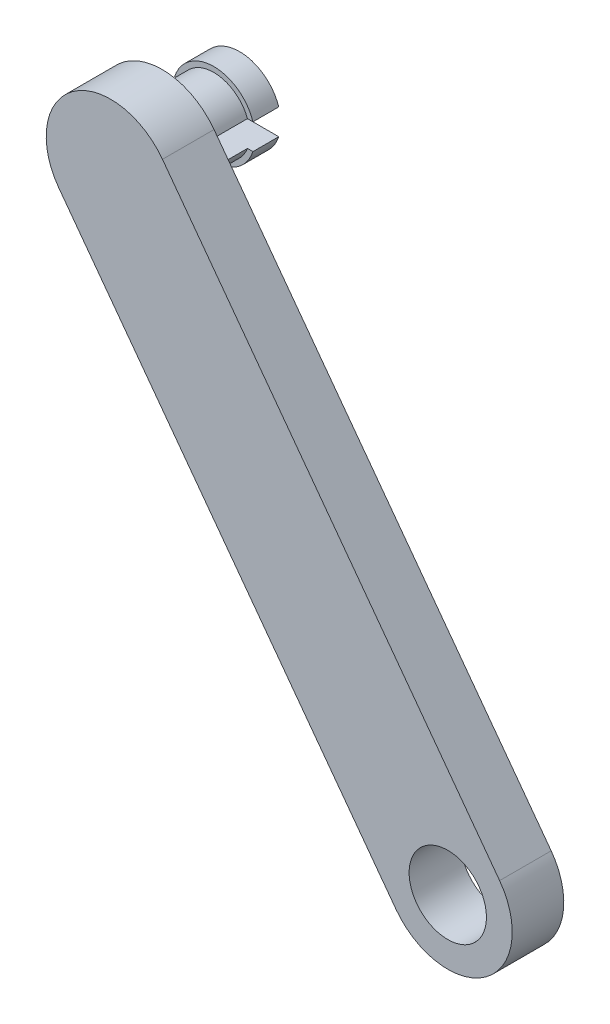
ISO-10303-21;
HEADER;
FILE_DESCRIPTION(('STEP AP214'),'2;1');
FILE_NAME('part.step','',(''),(''),'','','');
FILE_SCHEMA(('AUTOMOTIVE_DESIGN { 1 0 10303 214 1 1 1 1 }'));
ENDSEC;
DATA;
#1=APPLICATION_CONTEXT('core data for automotive mechanical design processes');
#2=APPLICATION_PROTOCOL_DEFINITION('international standard','automotive_design',2000,#1);
#3=PRODUCT_CONTEXT('',#1,'mechanical');
#4=PRODUCT('Part','Part','',(#3));
#5=PRODUCT_RELATED_PRODUCT_CATEGORY('part','',(#4));
#6=PRODUCT_DEFINITION_FORMATION('','',#4);
#7=PRODUCT_DEFINITION_CONTEXT('part definition',#1,'design');
#8=PRODUCT_DEFINITION('design','',#6,#7);
#9=PRODUCT_DEFINITION_SHAPE('','',#8);
#10=(LENGTH_UNIT() NAMED_UNIT(*) SI_UNIT(.MILLI.,.METRE.));
#11=(NAMED_UNIT(*) PLANE_ANGLE_UNIT() SI_UNIT($,.RADIAN.));
#12=(NAMED_UNIT(*) SI_UNIT($,.STERADIAN.) SOLID_ANGLE_UNIT());
#13=UNCERTAINTY_MEASURE_WITH_UNIT(LENGTH_MEASURE(1.E-05),#10,'distance_accuracy_value','');
#14=(GEOMETRIC_REPRESENTATION_CONTEXT(3) GLOBAL_UNCERTAINTY_ASSIGNED_CONTEXT((#13)) GLOBAL_UNIT_ASSIGNED_CONTEXT((#10,
#11,#12)) REPRESENTATION_CONTEXT('',''));
#15=CARTESIAN_POINT('',(0.,0.,0.));
#16=DIRECTION('',(0.,0.,1.));
#17=DIRECTION('',(1.,0.,0.));
#18=AXIS2_PLACEMENT_3D('',#15,#16,#17);
#19=CARTESIAN_POINT('',(-13.077128211328,12.691487154688,-2.));
#20=DIRECTION('',(0.,0.,1.));
#21=DIRECTION('',(1.,0.,0.));
#22=AXIS2_PLACEMENT_3D('',#19,#20,#21);
#23=CYLINDRICAL_SURFACE('',#22,1.4);
#24=DIRECTION('',(0.,0.,1.));
#25=VECTOR('',#24,1.);
#26=CARTESIAN_POINT('',(-14.3847978943902,13.191487154688,-2.));
#27=LINE('',#26,#25);
#28=CARTESIAN_POINT('',(-14.3847978943902,13.191487154688,0.));
#29=VERTEX_POINT('',#28);
#30=CARTESIAN_POINT('',(-14.3847978943902,13.191487154688,-2.));
#31=VERTEX_POINT('',#30);
#32=EDGE_CURVE('E163',#29,#31,#27,.F.);
#33=ORIENTED_EDGE('',*,*,#32,.F.);
#34=CARTESIAN_POINT('',(-13.077128211328,12.691487154688,0.));
#35=DIRECTION('',(0.,0.,1.));
#36=DIRECTION('',(1.,0.,0.));
#37=AXIS2_PLACEMENT_3D('',#34,#35,#36);
#38=CIRCLE('',#37,1.4);
#39=CARTESIAN_POINT('',(-11.7694585282658,13.191487154688,0.));
#40=VERTEX_POINT('',#39);
#41=EDGE_CURVE('E170',#40,#29,#38,.T.);
#42=ORIENTED_EDGE('',*,*,#41,.F.);
#43=DIRECTION('',(0.,0.,1.));
#44=VECTOR('',#43,1.);
#45=CARTESIAN_POINT('',(-11.7694585282658,13.191487154688,-2.));
#46=LINE('',#45,#44);
#47=CARTESIAN_POINT('',(-11.7694585282658,13.191487154688,-2.));
#48=VERTEX_POINT('',#47);
#49=EDGE_CURVE('E220',#48,#40,#46,.T.);
#50=ORIENTED_EDGE('',*,*,#49,.F.);
#51=CARTESIAN_POINT('',(-13.077128211328,12.691487154688,-2.));
#52=DIRECTION('',(0.,0.,1.));
#53=DIRECTION('',(1.,0.,0.));
#54=AXIS2_PLACEMENT_3D('',#51,#52,#53);
#55=CIRCLE('',#54,1.4);
#56=EDGE_CURVE('E166',#48,#31,#55,.T.);
#57=ORIENTED_EDGE('',*,*,#56,.T.);
#58=EDGE_LOOP('',(#33,#42,#50,#57));
#59=FACE_BOUND('',#58,.T.);
#60=ADVANCED_FACE('F37',(#59),#23,.T.);
#61=CARTESIAN_POINT('',(-13.077128211328,12.691487154688,-3.));
#62=DIRECTION('',(0.,0.,1.));
#63=DIRECTION('',(1.,0.,0.));
#64=AXIS2_PLACEMENT_3D('',#61,#62,#63);
#65=CYLINDRICAL_SURFACE('',#64,1.6);
#66=CARTESIAN_POINT('',(-13.077128211328,12.691487154688,-3.));
#67=DIRECTION('',(0.,0.,-1.));
#68=DIRECTION('',(-1.,0.,0.));
#69=AXIS2_PLACEMENT_3D('',#66,#67,#68);
#70=CIRCLE('',#69,1.6);
#71=CARTESIAN_POINT('',(-14.5969966266851,13.191487154688,-3.));
#72=VERTEX_POINT('',#71);
#73=CARTESIAN_POINT('',(-11.5572597959709,13.191487154688,-3.));
#74=VERTEX_POINT('',#73);
#75=EDGE_CURVE('E154',#72,#74,#70,.T.);
#76=ORIENTED_EDGE('',*,*,#75,.F.);
#77=DIRECTION('',(0.,0.,1.));
#78=VECTOR('',#77,1.);
#79=CARTESIAN_POINT('',(-14.5969966266851,13.191487154688,-3.));
#80=LINE('',#79,#78);
#81=CARTESIAN_POINT('',(-14.5969966266851,13.191487154688,-2.));
#82=VERTEX_POINT('',#81);
#83=EDGE_CURVE('E218',#72,#82,#80,.T.);
#84=ORIENTED_EDGE('',*,*,#83,.T.);
#85=CARTESIAN_POINT('',(-13.077128211328,12.691487154688,-2.));
#86=DIRECTION('',(0.,0.,-1.));
#87=DIRECTION('',(-1.,0.,0.));
#88=AXIS2_PLACEMENT_3D('',#85,#86,#87);
#89=CIRCLE('',#88,1.6);
#90=CARTESIAN_POINT('',(-11.5572597959709,13.191487154688,-2.));
#91=VERTEX_POINT('',#90);
#92=EDGE_CURVE('E155',#82,#91,#89,.T.);
#93=ORIENTED_EDGE('',*,*,#92,.T.);
#94=DIRECTION('',(0.,0.,1.));
#95=VECTOR('',#94,1.);
#96=CARTESIAN_POINT('',(-11.5572597959709,13.191487154688,-3.));
#97=LINE('',#96,#95);
#98=EDGE_CURVE('E217',#91,#74,#97,.F.);
#99=ORIENTED_EDGE('',*,*,#98,.T.);
#100=EDGE_LOOP('',(#76,#84,#93,#99));
#101=FACE_BOUND('',#100,.T.);
#102=ADVANCED_FACE('F216',(#101),#65,.T.);
#103=CARTESIAN_POINT('',(-13.077128211328,12.691487154688,-3.));
#104=DIRECTION('',(0.,0.,-1.));
#105=DIRECTION('',(-1.,0.,0.));
#106=AXIS2_PLACEMENT_3D('',#103,#104,#105);
#107=PLANE('',#106);
#108=DIRECTION('',(1.,0.,0.));
#109=VECTOR('',#108,1.);
#110=CARTESIAN_POINT('',(-11.077128211328,13.191487154688,-3.));
#111=LINE('',#110,#109);
#112=EDGE_CURVE('E151',#72,#74,#111,.T.);
#113=ORIENTED_EDGE('',*,*,#112,.F.);
#114=ORIENTED_EDGE('',*,*,#75,.T.);
#115=EDGE_LOOP('',(#113,#114));
#116=FACE_BOUND('',#115,.T.);
#117=ADVANCED_FACE('F252',(#116),#107,.T.);
#118=CARTESIAN_POINT('',(-13.077128211328,12.691487154688,-2.));
#119=DIRECTION('',(0.,0.,-1.));
#120=DIRECTION('',(-1.,0.,0.));
#121=AXIS2_PLACEMENT_3D('',#118,#119,#120);
#122=PLANE('',#121);
#123=ORIENTED_EDGE('',*,*,#92,.F.);
#124=DIRECTION('',(1.,0.,0.));
#125=VECTOR('',#124,1.);
#126=CARTESIAN_POINT('',(-13.077128211328,13.191487154688,-2.));
#127=LINE('',#126,#125);
#128=EDGE_CURVE('E11',#82,#31,#127,.T.);
#129=ORIENTED_EDGE('',*,*,#128,.T.);
#130=ORIENTED_EDGE('',*,*,#56,.F.);
#131=EDGE_CURVE('E41',#48,#91,#127,.T.);
#132=ORIENTED_EDGE('',*,*,#131,.T.);
#133=EDGE_LOOP('',(#123,#129,#130,#132));
#134=FACE_BOUND('',#133,.T.);
#135=ADVANCED_FACE('F209',(#134),#122,.F.);
#136=CARTESIAN_POINT('',(0.,-5.,2.));
#137=DIRECTION('',(0.,0.,-1.));
#138=DIRECTION('',(-1.,0.,0.));
#139=AXIS2_PLACEMENT_3D('',#136,#137,#138);
#140=CYLINDRICAL_SURFACE('',#139,2.5);
#141=CARTESIAN_POINT('',(0.,-5.,0.));
#142=DIRECTION('',(0.,0.,1.));
#143=DIRECTION('',(1.,0.,0.));
#144=AXIS2_PLACEMENT_3D('',#141,#142,#143);
#145=CIRCLE('',#144,2.5);
#146=CARTESIAN_POINT('',(-2.01039626757818,-6.48603729674182,0.));
#147=VERTEX_POINT('',#146);
#148=CARTESIAN_POINT('',(2.01039626757818,-3.51396270325818,0.));
#149=VERTEX_POINT('',#148);
#150=EDGE_CURVE('E177',#147,#149,#145,.T.);
#151=ORIENTED_EDGE('',*,*,#150,.T.);
#152=DIRECTION('',(0.,0.,-1.));
#153=VECTOR('',#152,1.);
#154=CARTESIAN_POINT('',(2.01039626757818,-3.51396270325818,2.));
#155=LINE('',#154,#153);
#156=CARTESIAN_POINT('',(2.01039626757818,-3.51396270325818,2.));
#157=VERTEX_POINT('',#156);
#158=EDGE_CURVE('E200',#157,#149,#155,.T.);
#159=ORIENTED_EDGE('',*,*,#158,.F.);
#160=CARTESIAN_POINT('',(0.,-5.,2.));
#161=DIRECTION('',(0.,0.,1.));
#162=DIRECTION('',(1.,0.,0.));
#163=AXIS2_PLACEMENT_3D('',#160,#161,#162);
#164=CIRCLE('',#163,2.5);
#165=CARTESIAN_POINT('',(-2.01039626757818,-6.48603729674182,2.));
#166=VERTEX_POINT('',#165);
#167=EDGE_CURVE('E180',#166,#157,#164,.T.);
#168=ORIENTED_EDGE('',*,*,#167,.F.);
#169=DIRECTION('',(0.,0.,-1.));
#170=VECTOR('',#169,1.);
#171=CARTESIAN_POINT('',(-2.01039626757818,-6.48603729674182,2.));
#172=LINE('',#171,#170);
#173=EDGE_CURVE('E186',#166,#147,#172,.T.);
#174=ORIENTED_EDGE('',*,*,#173,.T.);
#175=EDGE_LOOP('',(#151,#159,#168,#174));
#176=FACE_BOUND('',#175,.T.);
#177=ADVANCED_FACE('F39',(#176),#140,.T.);
#178=CARTESIAN_POINT('',(2.01039626757818,-3.51396270325818,2.));
#179=DIRECTION('',(-0.804158507031271,-0.594414918696728,0.));
#180=DIRECTION('',(0.594414918696728,-0.804158507031271,0.));
#181=AXIS2_PLACEMENT_3D('',#178,#179,#180);
#182=PLANE('',#181);
#183=DIRECTION('',(-0.594414918696728,0.804158507031271,0.));
#184=VECTOR('',#183,1.);
#185=CARTESIAN_POINT('',(2.01039626757818,-3.51396270325818,0.));
#186=LINE('',#185,#184);
#187=CARTESIAN_POINT('',(-11.0667319437498,14.1775244514298,0.));
#188=VERTEX_POINT('',#187);
#189=EDGE_CURVE('E189',#149,#188,#186,.T.);
#190=ORIENTED_EDGE('',*,*,#189,.T.);
#191=DIRECTION('',(0.,0.,-1.));
#192=VECTOR('',#191,1.);
#193=CARTESIAN_POINT('',(-11.0667319437498,14.1775244514298,2.));
#194=LINE('',#193,#192);
#195=CARTESIAN_POINT('',(-11.0667319437498,14.1775244514298,2.));
#196=VERTEX_POINT('',#195);
#197=EDGE_CURVE('E197',#196,#188,#194,.T.);
#198=ORIENTED_EDGE('',*,*,#197,.F.);
#199=DIRECTION('',(-0.594414918696728,0.804158507031271,0.));
#200=VECTOR('',#199,1.);
#201=CARTESIAN_POINT('',(2.01039626757818,-3.51396270325818,2.));
#202=LINE('',#201,#200);
#203=EDGE_CURVE('E90',#157,#196,#202,.T.);
#204=ORIENTED_EDGE('',*,*,#203,.F.);
#205=ORIENTED_EDGE('',*,*,#158,.T.);
#206=EDGE_LOOP('',(#190,#198,#204,#205));
#207=FACE_BOUND('',#206,.T.);
#208=ADVANCED_FACE('F287',(#207),#182,.F.);
#209=CARTESIAN_POINT('',(-13.077128211328,12.691487154688,2.));
#210=DIRECTION('',(0.,0.,-1.));
#211=DIRECTION('',(-1.,0.,0.));
#212=AXIS2_PLACEMENT_3D('',#209,#210,#211);
#213=CYLINDRICAL_SURFACE('',#212,2.5);
#214=CARTESIAN_POINT('',(-13.077128211328,12.691487154688,0.));
#215=DIRECTION('',(0.,0.,1.));
#216=DIRECTION('',(1.,0.,0.));
#217=AXIS2_PLACEMENT_3D('',#214,#215,#216);
#218=CIRCLE('',#217,2.5);
#219=CARTESIAN_POINT('',(-15.0875244789062,11.2054498579461,0.));
#220=VERTEX_POINT('',#219);
#221=EDGE_CURVE('E191',#188,#220,#218,.T.);
#222=ORIENTED_EDGE('',*,*,#221,.T.);
#223=DIRECTION('',(0.,0.,-1.));
#224=VECTOR('',#223,1.);
#225=CARTESIAN_POINT('',(-15.0875244789062,11.2054498579461,2.));
#226=LINE('',#225,#224);
#227=CARTESIAN_POINT('',(-15.0875244789062,11.2054498579461,2.));
#228=VERTEX_POINT('',#227);
#229=EDGE_CURVE('E195',#228,#220,#226,.T.);
#230=ORIENTED_EDGE('',*,*,#229,.F.);
#231=CARTESIAN_POINT('',(-13.077128211328,12.691487154688,2.));
#232=DIRECTION('',(0.,0.,1.));
#233=DIRECTION('',(1.,0.,0.));
#234=AXIS2_PLACEMENT_3D('',#231,#232,#233);
#235=CIRCLE('',#234,2.5);
#236=EDGE_CURVE('E183',#196,#228,#235,.T.);
#237=ORIENTED_EDGE('',*,*,#236,.F.);
#238=ORIENTED_EDGE('',*,*,#197,.T.);
#239=EDGE_LOOP('',(#222,#230,#237,#238));
#240=FACE_BOUND('',#239,.T.);
#241=ADVANCED_FACE('F285',(#240),#213,.T.);
#242=CARTESIAN_POINT('',(-2.01039626757818,-6.48603729674182,2.));
#243=DIRECTION('',(0.804158507031271,0.594414918696728,0.));
#244=DIRECTION('',(-0.594414918696728,0.804158507031271,0.));
#245=AXIS2_PLACEMENT_3D('',#242,#243,#244);
#246=PLANE('',#245);
#247=DIRECTION('',(0.594414918696728,-0.804158507031271,0.));
#248=VECTOR('',#247,1.);
#249=CARTESIAN_POINT('',(-2.01039626757818,-6.48603729674182,0.));
#250=LINE('',#249,#248);
#251=EDGE_CURVE('E82',#220,#147,#250,.T.);
#252=ORIENTED_EDGE('',*,*,#251,.T.);
#253=ORIENTED_EDGE('',*,*,#173,.F.);
#254=DIRECTION('',(0.594414918696728,-0.804158507031271,0.));
#255=VECTOR('',#254,1.);
#256=CARTESIAN_POINT('',(-2.01039626757818,-6.48603729674182,2.));
#257=LINE('',#256,#255);
#258=EDGE_CURVE('E61',#228,#166,#257,.T.);
#259=ORIENTED_EDGE('',*,*,#258,.F.);
#260=ORIENTED_EDGE('',*,*,#229,.T.);
#261=EDGE_LOOP('',(#252,#253,#259,#260));
#262=FACE_BOUND('',#261,.T.);
#263=ADVANCED_FACE('F280',(#262),#246,.F.);
#264=CARTESIAN_POINT('',(0.,-5.,2.));
#265=DIRECTION('',(0.,0.,1.));
#266=DIRECTION('',(1.,0.,0.));
#267=AXIS2_PLACEMENT_3D('',#264,#265,#266);
#268=PLANE('',#267);
#269=CARTESIAN_POINT('',(0.,-5.,2.));
#270=DIRECTION('',(0.,0.,1.));
#271=DIRECTION('',(1.,0.,0.));
#272=AXIS2_PLACEMENT_3D('',#269,#270,#271);
#273=CIRCLE('',#272,1.5);
#274=CARTESIAN_POINT('',(1.5,-5.,2.));
#275=VERTEX_POINT('',#274);
#276=EDGE_CURVE('E173',#275,#275,#273,.T.);
#277=ORIENTED_EDGE('',*,*,#276,.F.);
#278=EDGE_LOOP('',(#277));
#279=FACE_BOUND('',#278,.T.);
#280=ORIENTED_EDGE('',*,*,#167,.T.);
#281=ORIENTED_EDGE('',*,*,#203,.T.);
#282=ORIENTED_EDGE('',*,*,#236,.T.);
#283=ORIENTED_EDGE('',*,*,#258,.T.);
#284=EDGE_LOOP('',(#280,#281,#282,#283));
#285=FACE_BOUND('',#284,.T.);
#286=ADVANCED_FACE('F273',(#279,#285),#268,.T.);
#287=CARTESIAN_POINT('',(0.,-5.,0.));
#288=DIRECTION('',(0.,0.,1.));
#289=DIRECTION('',(1.,0.,0.));
#290=AXIS2_PLACEMENT_3D('',#287,#288,#289);
#291=PLANE('',#290);
#292=DIRECTION('',(1.,0.,0.));
#293=VECTOR('',#292,1.);
#294=CARTESIAN_POINT('',(-11.077128211328,13.191487154688,0.));
#295=LINE('',#294,#293);
#296=EDGE_CURVE('E227',#29,#40,#295,.T.);
#297=ORIENTED_EDGE('',*,*,#296,.T.);
#298=ORIENTED_EDGE('',*,*,#41,.T.);
#299=EDGE_LOOP('',(#297,#298));
#300=FACE_BOUND('',#299,.T.);
#301=DIRECTION('',(-1.,0.,0.));
#302=VECTOR('',#301,1.);
#303=CARTESIAN_POINT('',(-11.077128211328,12.191487154688,0.));
#304=LINE('',#303,#302);
#305=CARTESIAN_POINT('',(-11.7694585282658,12.191487154688,0.));
#306=VERTEX_POINT('',#305);
#307=CARTESIAN_POINT('',(-14.3847978943902,12.191487154688,0.));
#308=VERTEX_POINT('',#307);
#309=EDGE_CURVE('E228',#306,#308,#304,.T.);
#310=ORIENTED_EDGE('',*,*,#309,.T.);
#311=EDGE_CURVE('E169',#308,#306,#38,.T.);
#312=ORIENTED_EDGE('',*,*,#311,.T.);
#313=EDGE_LOOP('',(#310,#312));
#314=FACE_BOUND('',#313,.T.);
#315=CARTESIAN_POINT('',(0.,-5.,0.));
#316=DIRECTION('',(0.,0.,1.));
#317=DIRECTION('',(1.,0.,0.));
#318=AXIS2_PLACEMENT_3D('',#315,#316,#317);
#319=CIRCLE('',#318,1.5);
#320=CARTESIAN_POINT('',(1.5,-5.,0.));
#321=VERTEX_POINT('',#320);
#322=EDGE_CURVE('E174',#321,#321,#319,.T.);
#323=ORIENTED_EDGE('',*,*,#322,.T.);
#324=EDGE_LOOP('',(#323));
#325=FACE_BOUND('',#324,.T.);
#326=ORIENTED_EDGE('',*,*,#150,.F.);
#327=ORIENTED_EDGE('',*,*,#251,.F.);
#328=ORIENTED_EDGE('',*,*,#221,.F.);
#329=ORIENTED_EDGE('',*,*,#189,.F.);
#330=EDGE_LOOP('',(#326,#327,#328,#329));
#331=FACE_BOUND('',#330,.T.);
#332=ADVANCED_FACE('F236',(#300,#314,#325,#331),#291,.F.);
#333=CARTESIAN_POINT('',(0.,-5.,0.));
#334=DIRECTION('',(0.,0.,1.));
#335=DIRECTION('',(1.,0.,0.));
#336=AXIS2_PLACEMENT_3D('',#333,#334,#335);
#337=CYLINDRICAL_SURFACE('',#336,1.5);
#338=ORIENTED_EDGE('',*,*,#322,.F.);
#339=EDGE_LOOP('',(#338));
#340=FACE_BOUND('',#339,.T.);
#341=ORIENTED_EDGE('',*,*,#276,.T.);
#342=EDGE_LOOP('',(#341));
#343=FACE_BOUND('',#342,.T.);
#344=ADVANCED_FACE('F264',(#340,#343),#337,.F.);
#345=DIRECTION('',(0.,0.,1.));
#346=VECTOR('',#345,1.);
#347=CARTESIAN_POINT('',(-11.7694585282658,12.191487154688,-2.));
#348=LINE('',#347,#346);
#349=CARTESIAN_POINT('',(-11.7694585282658,12.191487154688,-2.));
#350=VERTEX_POINT('',#349);
#351=EDGE_CURVE('E144',#306,#350,#348,.F.);
#352=ORIENTED_EDGE('',*,*,#351,.F.);
#353=ORIENTED_EDGE('',*,*,#311,.F.);
#354=DIRECTION('',(0.,0.,1.));
#355=VECTOR('',#354,1.);
#356=CARTESIAN_POINT('',(-14.3847978943902,12.191487154688,-2.));
#357=LINE('',#356,#355);
#358=CARTESIAN_POINT('',(-14.3847978943902,12.191487154688,-2.));
#359=VERTEX_POINT('',#358);
#360=EDGE_CURVE('E145',#359,#308,#357,.T.);
#361=ORIENTED_EDGE('',*,*,#360,.F.);
#362=EDGE_CURVE('E158',#359,#350,#55,.T.);
#363=ORIENTED_EDGE('',*,*,#362,.T.);
#364=EDGE_LOOP('',(#352,#353,#361,#363));
#365=FACE_BOUND('',#364,.T.);
#366=ADVANCED_FACE('F241',(#365),#23,.T.);
#367=CARTESIAN_POINT('',(-11.5572597959709,12.191487154688,-3.));
#368=VERTEX_POINT('',#367);
#369=CARTESIAN_POINT('',(-14.5969966266851,12.191487154688,-3.));
#370=VERTEX_POINT('',#369);
#371=EDGE_CURVE('E150',#368,#370,#70,.T.);
#372=ORIENTED_EDGE('',*,*,#371,.F.);
#373=DIRECTION('',(0.,0.,1.));
#374=VECTOR('',#373,1.);
#375=CARTESIAN_POINT('',(-11.5572597959709,12.191487154688,-3.));
#376=LINE('',#375,#374);
#377=CARTESIAN_POINT('',(-11.5572597959709,12.191487154688,-2.));
#378=VERTEX_POINT('',#377);
#379=EDGE_CURVE('E134',#368,#378,#376,.T.);
#380=ORIENTED_EDGE('',*,*,#379,.T.);
#381=CARTESIAN_POINT('',(-14.5969966266851,12.191487154688,-2.));
#382=VERTEX_POINT('',#381);
#383=EDGE_CURVE('E160',#378,#382,#89,.T.);
#384=ORIENTED_EDGE('',*,*,#383,.T.);
#385=DIRECTION('',(0.,0.,1.));
#386=VECTOR('',#385,1.);
#387=CARTESIAN_POINT('',(-14.5969966266851,12.191487154688,-3.));
#388=LINE('',#387,#386);
#389=EDGE_CURVE('E52',#382,#370,#388,.F.);
#390=ORIENTED_EDGE('',*,*,#389,.T.);
#391=EDGE_LOOP('',(#372,#380,#384,#390));
#392=FACE_BOUND('',#391,.T.);
#393=ADVANCED_FACE('F153',(#392),#65,.T.);
#394=DIRECTION('',(-1.,0.,0.));
#395=VECTOR('',#394,1.);
#396=CARTESIAN_POINT('',(-11.077128211328,12.191487154688,-3.));
#397=LINE('',#396,#395);
#398=EDGE_CURVE('E137',#368,#370,#397,.T.);
#399=ORIENTED_EDGE('',*,*,#398,.F.);
#400=ORIENTED_EDGE('',*,*,#371,.T.);
#401=EDGE_LOOP('',(#399,#400));
#402=FACE_BOUND('',#401,.T.);
#403=ADVANCED_FACE('F149',(#402),#107,.T.);
#404=ORIENTED_EDGE('',*,*,#383,.F.);
#405=DIRECTION('',(-1.,0.,0.));
#406=VECTOR('',#405,1.);
#407=CARTESIAN_POINT('',(-13.077128211328,12.191487154688,-2.));
#408=LINE('',#407,#406);
#409=EDGE_CURVE('E139',#378,#350,#408,.T.);
#410=ORIENTED_EDGE('',*,*,#409,.T.);
#411=ORIENTED_EDGE('',*,*,#362,.F.);
#412=EDGE_CURVE('E201',#359,#382,#408,.T.);
#413=ORIENTED_EDGE('',*,*,#412,.T.);
#414=EDGE_LOOP('',(#404,#410,#411,#413));
#415=FACE_BOUND('',#414,.T.);
#416=ADVANCED_FACE('F242',(#415),#122,.F.);
#417=CARTESIAN_POINT('',(-11.077128211328,13.191487154688,0.));
#418=DIRECTION('',(0.,1.,0.));
#419=DIRECTION('',(0.,0.,1.));
#420=AXIS2_PLACEMENT_3D('',#417,#418,#419);
#421=PLANE('',#420);
#422=ORIENTED_EDGE('',*,*,#32,.T.);
#423=ORIENTED_EDGE('',*,*,#128,.F.);
#424=ORIENTED_EDGE('',*,*,#83,.F.);
#425=ORIENTED_EDGE('',*,*,#112,.T.);
#426=ORIENTED_EDGE('',*,*,#98,.F.);
#427=ORIENTED_EDGE('',*,*,#131,.F.);
#428=ORIENTED_EDGE('',*,*,#49,.T.);
#429=ORIENTED_EDGE('',*,*,#296,.F.);
#430=EDGE_LOOP('',(#422,#423,#424,#425,#426,#427,#428,#429));
#431=FACE_BOUND('',#430,.T.);
#432=ADVANCED_FACE('F244',(#431),#421,.F.);
#433=CARTESIAN_POINT('',(-11.077128211328,12.191487154688,0.));
#434=DIRECTION('',(0.,-1.,0.));
#435=DIRECTION('',(0.,0.,-1.));
#436=AXIS2_PLACEMENT_3D('',#433,#434,#435);
#437=PLANE('',#436);
#438=ORIENTED_EDGE('',*,*,#351,.T.);
#439=ORIENTED_EDGE('',*,*,#409,.F.);
#440=ORIENTED_EDGE('',*,*,#379,.F.);
#441=ORIENTED_EDGE('',*,*,#398,.T.);
#442=ORIENTED_EDGE('',*,*,#389,.F.);
#443=ORIENTED_EDGE('',*,*,#412,.F.);
#444=ORIENTED_EDGE('',*,*,#360,.T.);
#445=ORIENTED_EDGE('',*,*,#309,.F.);
#446=EDGE_LOOP('',(#438,#439,#440,#441,#442,#443,#444,#445));
#447=FACE_BOUND('',#446,.T.);
#448=ADVANCED_FACE('F136',(#447),#437,.F.);
#449=CLOSED_SHELL('',(#60,#102,#117,#135,#177,#208,#241,#263,#286,#332,#344,#366,#393,#403,#416,
#432,#448));
#450=MANIFOLD_SOLID_BREP('B2',#449);
#451=ADVANCED_BREP_SHAPE_REPRESENTATION('',(#18,#450),#14);
#452=SHAPE_DEFINITION_REPRESENTATION(#9,#451);
ENDSEC;
END-ISO-10303-21;
